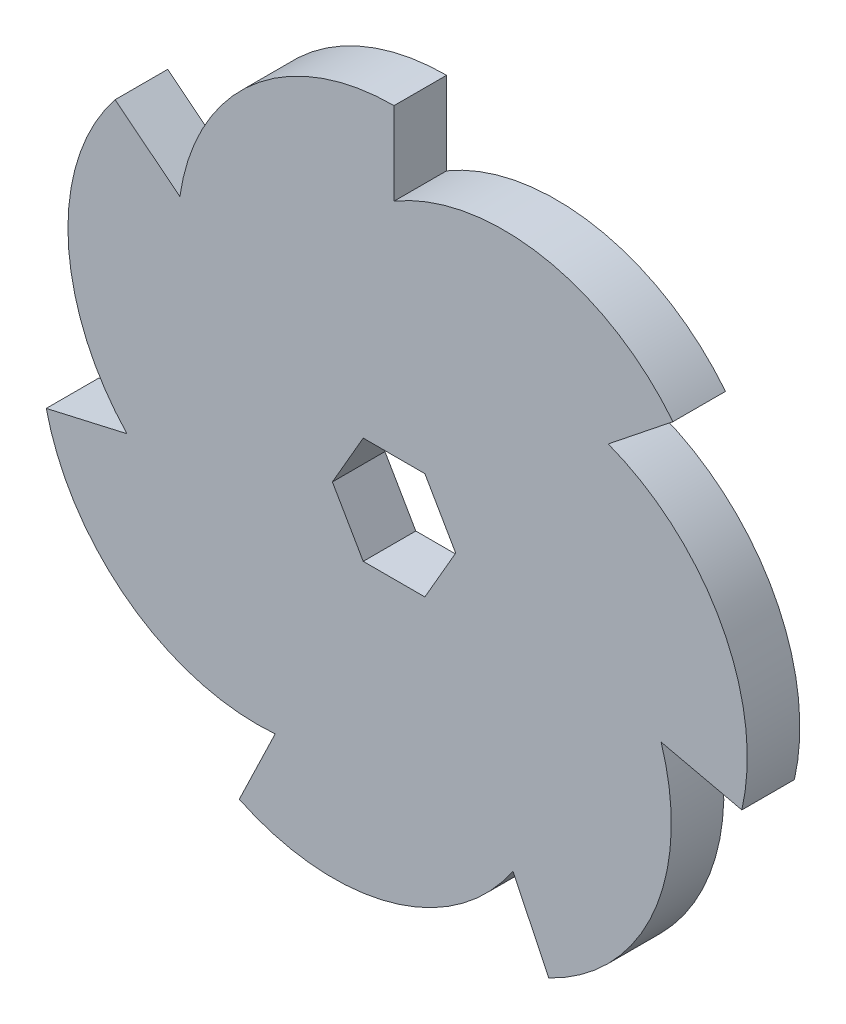
ISO-10303-21;
HEADER;
FILE_DESCRIPTION(('STEP AP214'),'2;1');
FILE_NAME('part.step','',(''),(''),'','','');
FILE_SCHEMA(('AUTOMOTIVE_DESIGN { 1 0 10303 214 1 1 1 1 }'));
ENDSEC;
DATA;
#1=APPLICATION_CONTEXT('core data for automotive mechanical design processes');
#2=APPLICATION_PROTOCOL_DEFINITION('international standard','automotive_design',2000,#1);
#3=PRODUCT_CONTEXT('',#1,'mechanical');
#4=PRODUCT('Part','Part','',(#3));
#5=PRODUCT_RELATED_PRODUCT_CATEGORY('part','',(#4));
#6=PRODUCT_DEFINITION_FORMATION('','',#4);
#7=PRODUCT_DEFINITION_CONTEXT('part definition',#1,'design');
#8=PRODUCT_DEFINITION('design','',#6,#7);
#9=PRODUCT_DEFINITION_SHAPE('','',#8);
#10=(LENGTH_UNIT() NAMED_UNIT(*) SI_UNIT(.MILLI.,.METRE.));
#11=(NAMED_UNIT(*) PLANE_ANGLE_UNIT() SI_UNIT($,.RADIAN.));
#12=(NAMED_UNIT(*) SI_UNIT($,.STERADIAN.) SOLID_ANGLE_UNIT());
#13=UNCERTAINTY_MEASURE_WITH_UNIT(LENGTH_MEASURE(1.E-05),#10,'distance_accuracy_value','');
#14=(GEOMETRIC_REPRESENTATION_CONTEXT(3) GLOBAL_UNCERTAINTY_ASSIGNED_CONTEXT((#13)) GLOBAL_UNIT_ASSIGNED_CONTEXT((#10,
#11,#12)) REPRESENTATION_CONTEXT('',''));
#15=CARTESIAN_POINT('',(0.,0.,0.));
#16=DIRECTION('',(0.,0.,1.));
#17=DIRECTION('',(1.,0.,0.));
#18=AXIS2_PLACEMENT_3D('',#15,#16,#17);
#19=CARTESIAN_POINT('',(0.,0.,3.175));
#20=DIRECTION('',(-0.623489801858732,0.781831482468031,0.));
#21=DIRECTION('',(-0.781831482468031,-0.623489801858732,0.));
#22=AXIS2_PLACEMENT_3D('',#19,#20,#21);
#23=PLANE('',#22);
#24=DIRECTION('',(0.,0.,-1.));
#25=VECTOR('',#24,1.);
#26=CARTESIAN_POINT('',(25.8786220696918,20.637512441524,3.175));
#27=LINE('',#26,#25);
#28=CARTESIAN_POINT('',(25.8786220696918,20.637512441524,3.175));
#29=VERTEX_POINT('',#28);
#30=CARTESIAN_POINT('',(25.8786220696918,20.637512441524,-3.175));
#31=VERTEX_POINT('',#30);
#32=EDGE_CURVE('E369',#29,#31,#27,.T.);
#33=ORIENTED_EDGE('',*,*,#32,.T.);
#34=DIRECTION('',(0.781831482468031,0.623489801858732,0.));
#35=VECTOR('',#34,1.);
#36=CARTESIAN_POINT('',(0.,0.,-3.175));
#37=LINE('',#36,#35);
#38=CARTESIAN_POINT('',(33.6969368943721,26.8724104601114,-3.175));
#39=VERTEX_POINT('',#38);
#40=EDGE_CURVE('E377',#31,#39,#37,.T.);
#41=ORIENTED_EDGE('',*,*,#40,.T.);
#42=DIRECTION('',(0.,0.,-1.));
#43=VECTOR('',#42,1.);
#44=CARTESIAN_POINT('',(33.6969368943721,26.8724104601114,3.175));
#45=LINE('',#44,#43);
#46=CARTESIAN_POINT('',(33.6969368943721,26.8724104601114,3.175));
#47=VERTEX_POINT('',#46);
#48=EDGE_CURVE('E48',#47,#39,#45,.T.);
#49=ORIENTED_EDGE('',*,*,#48,.F.);
#50=DIRECTION('',(0.781831482468031,0.623489801858732,0.));
#51=VECTOR('',#50,1.);
#52=CARTESIAN_POINT('',(0.,0.,3.175));
#53=LINE('',#52,#51);
#54=EDGE_CURVE('E376',#29,#47,#53,.T.);
#55=ORIENTED_EDGE('',*,*,#54,.F.);
#56=EDGE_LOOP('',(#33,#41,#49,#55));
#57=FACE_BOUND('',#56,.T.);
#58=ADVANCED_FACE('F39',(#57),#23,.F.);
#59=CARTESIAN_POINT('',(13.2611223064615,10.5753921461179,3.175));
#60=DIRECTION('',(0.,0.,-1.));
#61=DIRECTION('',(-1.,0.,0.));
#62=AXIS2_PLACEMENT_3D('',#59,#60,#61);
#63=CYLINDRICAL_SURFACE('',#62,26.1383879341879);
#64=CARTESIAN_POINT('',(13.2611223064615,10.5753921461179,-3.175));
#65=DIRECTION('',(0.,0.,1.));
#66=DIRECTION('',(-1.,0.,0.));
#67=AXIS2_PLACEMENT_3D('',#64,#65,#66);
#68=CIRCLE('',#67,26.1383879341879);
#69=CARTESIAN_POINT('',(0.,33.1,-3.175));
#70=VERTEX_POINT('',#69);
#71=EDGE_CURVE('E372',#39,#70,#68,.T.);
#72=ORIENTED_EDGE('',*,*,#71,.T.);
#73=DIRECTION('',(0.,0.,-1.));
#74=VECTOR('',#73,1.);
#75=CARTESIAN_POINT('',(0.,33.1,3.175));
#76=LINE('',#75,#74);
#77=CARTESIAN_POINT('',(0.,33.1,3.175));
#78=VERTEX_POINT('',#77);
#79=EDGE_CURVE('E11',#78,#70,#76,.T.);
#80=ORIENTED_EDGE('',*,*,#79,.F.);
#81=CARTESIAN_POINT('',(13.2611223064615,10.5753921461179,3.175));
#82=DIRECTION('',(0.,0.,1.));
#83=DIRECTION('',(-1.,0.,0.));
#84=AXIS2_PLACEMENT_3D('',#81,#82,#83);
#85=CIRCLE('',#84,26.1383879341879);
#86=EDGE_CURVE('E373',#47,#78,#85,.T.);
#87=ORIENTED_EDGE('',*,*,#86,.F.);
#88=ORIENTED_EDGE('',*,*,#48,.T.);
#89=EDGE_LOOP('',(#72,#80,#87,#88));
#90=FACE_BOUND('',#89,.T.);
#91=ADVANCED_FACE('F41',(#90),#63,.T.);
#92=CARTESIAN_POINT('',(13.2611223064615,10.5753921461179,3.175));
#93=DIRECTION('',(0.,0.,-1.));
#94=DIRECTION('',(-1.,0.,0.));
#95=AXIS2_PLACEMENT_3D('',#92,#93,#94);
#96=PLANE('',#95);
#97=DIRECTION('',(-0.5,0.866025403784438,0.));
#98=VECTOR('',#97,1.);
#99=CARTESIAN_POINT('',(7.44781847254618,0.,3.175));
#100=LINE('',#99,#98);
#101=CARTESIAN_POINT('',(7.44781847254617,0.,3.175));
#102=VERTEX_POINT('',#101);
#103=CARTESIAN_POINT('',(3.72390923627309,6.45,3.175));
#104=VERTEX_POINT('',#103);
#105=EDGE_CURVE('E219',#102,#104,#100,.T.);
#106=ORIENTED_EDGE('',*,*,#105,.F.);
#107=DIRECTION('',(0.5,0.866025403784439,0.));
#108=VECTOR('',#107,1.);
#109=CARTESIAN_POINT('',(3.72390923627309,-6.45,3.175));
#110=LINE('',#109,#108);
#111=CARTESIAN_POINT('',(3.72390923627309,-6.45,3.175));
#112=VERTEX_POINT('',#111);
#113=EDGE_CURVE('E55',#112,#102,#110,.T.);
#114=ORIENTED_EDGE('',*,*,#113,.F.);
#115=DIRECTION('',(1.,0.,0.));
#116=VECTOR('',#115,1.);
#117=CARTESIAN_POINT('',(-3.72390923627308,-6.45,3.175));
#118=LINE('',#117,#116);
#119=CARTESIAN_POINT('',(-3.72390923627308,-6.45,3.175));
#120=VERTEX_POINT('',#119);
#121=EDGE_CURVE('E199',#120,#112,#118,.T.);
#122=ORIENTED_EDGE('',*,*,#121,.F.);
#123=DIRECTION('',(0.5,-0.866025403784438,0.));
#124=VECTOR('',#123,1.);
#125=CARTESIAN_POINT('',(-7.44781847254617,0.,3.175));
#126=LINE('',#125,#124);
#127=CARTESIAN_POINT('',(-7.44781847254617,0.,3.175));
#128=VERTEX_POINT('',#127);
#129=EDGE_CURVE('E203',#128,#120,#126,.T.);
#130=ORIENTED_EDGE('',*,*,#129,.F.);
#131=DIRECTION('',(-0.5,-0.866025403784438,0.));
#132=VECTOR('',#131,1.);
#133=CARTESIAN_POINT('',(-3.72390923627309,6.45,3.175));
#134=LINE('',#133,#132);
#135=CARTESIAN_POINT('',(-3.72390923627309,6.45,3.175));
#136=VERTEX_POINT('',#135);
#137=EDGE_CURVE('E226',#136,#128,#134,.T.);
#138=ORIENTED_EDGE('',*,*,#137,.F.);
#139=DIRECTION('',(-1.,0.,0.));
#140=VECTOR('',#139,1.);
#141=CARTESIAN_POINT('',(3.72390923627309,6.45,3.175));
#142=LINE('',#141,#140);
#143=EDGE_CURVE('E222',#104,#136,#142,.T.);
#144=ORIENTED_EDGE('',*,*,#143,.F.);
#145=EDGE_LOOP('',(#106,#114,#122,#130,#138,#144));
#146=FACE_BOUND('',#145,.T.);
#147=CARTESIAN_POINT('',(16.5363490385602,-3.77431375828926,3.175));
#148=DIRECTION('',(0.,0.,1.));
#149=DIRECTION('',(-0.623489801858732,0.781831482468031,0.));
#150=AXIS2_PLACEMENT_3D('',#147,#148,#149);
#151=CIRCLE('',#150,26.1383879341879);
#152=CARTESIAN_POINT('',(42.0193930150366,-9.59065225351731,3.175));
#153=VERTEX_POINT('',#152);
#154=EDGE_CURVE('E352',#153,#29,#151,.T.);
#155=ORIENTED_EDGE('',*,*,#154,.T.);
#156=ORIENTED_EDGE('',*,*,#54,.T.);
#157=ORIENTED_EDGE('',*,*,#86,.T.);
#158=DIRECTION('',(0.,1.,0.));
#159=VECTOR('',#158,1.);
#160=CARTESIAN_POINT('',(0.,0.,3.175));
#161=LINE('',#160,#159);
#162=CARTESIAN_POINT('',(6.10622663543836E-13,43.1,3.175));
#163=VERTEX_POINT('',#162);
#164=EDGE_CURVE('E251',#78,#163,#161,.T.);
#165=ORIENTED_EDGE('',*,*,#164,.T.);
#166=CARTESIAN_POINT('',(2.37657116208823E-13,16.9616120658121,3.175));
#167=DIRECTION('',(0.,0.,1.));
#168=DIRECTION('',(-0.623489801858743,-0.781831482468022,0.));
#169=AXIS2_PLACEMENT_3D('',#166,#167,#168);
#170=CIRCLE('',#169,26.1383879341879);
#171=CARTESIAN_POINT('',(-25.8786220696915,20.6375124415244,3.175));
#172=VERTEX_POINT('',#171);
#173=EDGE_CURVE('E248',#163,#172,#170,.T.);
#174=ORIENTED_EDGE('',*,*,#173,.T.);
#175=DIRECTION('',(-0.781831482468023,0.623489801858743,0.));
#176=VECTOR('',#175,1.);
#177=CARTESIAN_POINT('',(0.,0.,3.175));
#178=LINE('',#177,#176);
#179=CARTESIAN_POINT('',(-33.6969368943718,26.8724104601118,3.175));
#180=VERTEX_POINT('',#179);
#181=EDGE_CURVE('E271',#172,#180,#178,.T.);
#182=ORIENTED_EDGE('',*,*,#181,.T.);
#183=CARTESIAN_POINT('',(-13.2611223064614,10.575392146118,3.175));
#184=DIRECTION('',(0.,0.,1.));
#185=DIRECTION('',(0.222520933956305,-0.974927912181826,0.));
#186=AXIS2_PLACEMENT_3D('',#183,#184,#185);
#187=CIRCLE('',#186,26.1383879341879);
#188=CARTESIAN_POINT('',(-32.2701138932184,-7.3654429139537,3.175));
#189=VERTEX_POINT('',#188);
#190=EDGE_CURVE('E268',#180,#189,#187,.T.);
#191=ORIENTED_EDGE('',*,*,#190,.T.);
#192=DIRECTION('',(-0.974927912181826,-0.222520933956305,0.));
#193=VECTOR('',#192,1.);
#194=CARTESIAN_POINT('',(0.,0.,3.175));
#195=LINE('',#194,#193);
#196=CARTESIAN_POINT('',(-42.0193930150367,-9.59065225351674,3.175));
#197=VERTEX_POINT('',#196);
#198=EDGE_CURVE('E291',#189,#197,#195,.T.);
#199=ORIENTED_EDGE('',*,*,#198,.T.);
#200=CARTESIAN_POINT('',(-16.5363490385602,-3.77431375828904,3.175));
#201=DIRECTION('',(0.,0.,1.));
#202=DIRECTION('',(0.900968867902416,-0.433883739117565,0.));
#203=AXIS2_PLACEMENT_3D('',#200,#201,#202);
#204=CIRCLE('',#203,26.1383879341879);
#205=CARTESIAN_POINT('',(-14.3615517647914,-29.82206952757,3.175));
#206=VERTEX_POINT('',#205);
#207=EDGE_CURVE('E288',#197,#206,#204,.T.);
#208=ORIENTED_EDGE('',*,*,#207,.T.);
#209=DIRECTION('',(-0.433883739117565,-0.900968867902416,0.));
#210=VECTOR('',#209,1.);
#211=CARTESIAN_POINT('',(0.,0.,3.175));
#212=LINE('',#211,#210);
#213=CARTESIAN_POINT('',(-18.7003891559671,-38.8317582065941,3.175));
#214=VERTEX_POINT('',#213);
#215=EDGE_CURVE('E312',#206,#214,#212,.T.);
#216=ORIENTED_EDGE('',*,*,#215,.T.);
#217=CARTESIAN_POINT('',(-7.35936766457616,-15.2818844207347,3.175));
#218=DIRECTION('',(0.,0.,1.));
#219=DIRECTION('',(0.900968867902422,0.433883739117553,0.));
#220=AXIS2_PLACEMENT_3D('',#217,#218,#219);
#221=CIRCLE('',#220,26.1383879341879);
#222=CARTESIAN_POINT('',(14.361551764791,-29.8220695275702,3.175));
#223=VERTEX_POINT('',#222);
#224=EDGE_CURVE('E308',#214,#223,#221,.T.);
#225=ORIENTED_EDGE('',*,*,#224,.T.);
#226=DIRECTION('',(0.433883739117553,-0.900968867902422,0.));
#227=VECTOR('',#226,1.);
#228=CARTESIAN_POINT('',(0.,0.,3.175));
#229=LINE('',#228,#227);
#230=CARTESIAN_POINT('',(18.7003891559665,-38.8317582065944,3.175));
#231=VERTEX_POINT('',#230);
#232=EDGE_CURVE('E334',#223,#231,#229,.T.);
#233=ORIENTED_EDGE('',*,*,#232,.T.);
#234=CARTESIAN_POINT('',(7.35936766457595,-15.2818844207348,3.175));
#235=DIRECTION('',(0.,0.,1.));
#236=DIRECTION('',(0.222520933956318,0.974927912181823,0.));
#237=AXIS2_PLACEMENT_3D('',#234,#235,#236);
#238=CIRCLE('',#237,26.1383879341879);
#239=CARTESIAN_POINT('',(32.2701138932183,-7.36544291395413,3.175));
#240=VERTEX_POINT('',#239);
#241=EDGE_CURVE('E330',#231,#240,#238,.T.);
#242=ORIENTED_EDGE('',*,*,#241,.T.);
#243=DIRECTION('',(0.974927912181823,-0.222520933956318,0.));
#244=VECTOR('',#243,1.);
#245=CARTESIAN_POINT('',(0.,0.,3.175));
#246=LINE('',#245,#244);
#247=EDGE_CURVE('E356',#240,#153,#246,.T.);
#248=ORIENTED_EDGE('',*,*,#247,.T.);
#249=EDGE_LOOP('',(#155,#156,#157,#165,#174,#182,#191,#199,#208,#216,#225,#233,#242,#248));
#250=FACE_BOUND('',#249,.T.);
#251=ADVANCED_FACE('F406',(#146,#250),#96,.F.);
#252=CARTESIAN_POINT('',(13.2611223064615,10.5753921461179,-3.175));
#253=DIRECTION('',(0.,0.,-1.));
#254=DIRECTION('',(-1.,0.,0.));
#255=AXIS2_PLACEMENT_3D('',#252,#253,#254);
#256=PLANE('',#255);
#257=DIRECTION('',(0.5,0.866025403784439,0.));
#258=VECTOR('',#257,1.);
#259=CARTESIAN_POINT('',(3.72390923627309,-6.45,-3.175));
#260=LINE('',#259,#258);
#261=CARTESIAN_POINT('',(3.72390923627309,-6.45,-3.175));
#262=VERTEX_POINT('',#261);
#263=CARTESIAN_POINT('',(7.44781847254618,0.,-3.175));
#264=VERTEX_POINT('',#263);
#265=EDGE_CURVE('E179',#262,#264,#260,.T.);
#266=ORIENTED_EDGE('',*,*,#265,.T.);
#267=DIRECTION('',(-0.5,0.866025403784438,0.));
#268=VECTOR('',#267,1.);
#269=CARTESIAN_POINT('',(7.44781847254618,0.,-3.175));
#270=LINE('',#269,#268);
#271=CARTESIAN_POINT('',(3.72390923627308,6.45,-3.175));
#272=VERTEX_POINT('',#271);
#273=EDGE_CURVE('E189',#264,#272,#270,.T.);
#274=ORIENTED_EDGE('',*,*,#273,.T.);
#275=DIRECTION('',(-1.,0.,0.));
#276=VECTOR('',#275,1.);
#277=CARTESIAN_POINT('',(3.72390923627309,6.45,-3.175));
#278=LINE('',#277,#276);
#279=CARTESIAN_POINT('',(-3.72390923627309,6.45,-3.175));
#280=VERTEX_POINT('',#279);
#281=EDGE_CURVE('E63',#272,#280,#278,.T.);
#282=ORIENTED_EDGE('',*,*,#281,.T.);
#283=DIRECTION('',(-0.5,-0.866025403784438,0.));
#284=VECTOR('',#283,1.);
#285=CARTESIAN_POINT('',(-3.72390923627309,6.45,-3.175));
#286=LINE('',#285,#284);
#287=CARTESIAN_POINT('',(-7.44781847254617,0.,-3.175));
#288=VERTEX_POINT('',#287);
#289=EDGE_CURVE('E208',#280,#288,#286,.T.);
#290=ORIENTED_EDGE('',*,*,#289,.T.);
#291=DIRECTION('',(0.5,-0.866025403784438,0.));
#292=VECTOR('',#291,1.);
#293=CARTESIAN_POINT('',(-7.44781847254617,0.,-3.175));
#294=LINE('',#293,#292);
#295=CARTESIAN_POINT('',(-3.72390923627308,-6.45,-3.175));
#296=VERTEX_POINT('',#295);
#297=EDGE_CURVE('E212',#288,#296,#294,.T.);
#298=ORIENTED_EDGE('',*,*,#297,.T.);
#299=DIRECTION('',(1.,0.,0.));
#300=VECTOR('',#299,1.);
#301=CARTESIAN_POINT('',(-3.72390923627308,-6.45,-3.175));
#302=LINE('',#301,#300);
#303=EDGE_CURVE('E186',#296,#262,#302,.T.);
#304=ORIENTED_EDGE('',*,*,#303,.T.);
#305=EDGE_LOOP('',(#266,#274,#282,#290,#298,#304));
#306=FACE_BOUND('',#305,.T.);
#307=ORIENTED_EDGE('',*,*,#40,.F.);
#308=CARTESIAN_POINT('',(16.5363490385602,-3.77431375828926,-3.175));
#309=DIRECTION('',(0.,0.,1.));
#310=DIRECTION('',(-0.623489801858732,0.781831482468031,0.));
#311=AXIS2_PLACEMENT_3D('',#308,#309,#310);
#312=CIRCLE('',#311,26.1383879341879);
#313=CARTESIAN_POINT('',(42.0193930150366,-9.59065225351731,-3.175));
#314=VERTEX_POINT('',#313);
#315=EDGE_CURVE('E351',#314,#31,#312,.T.);
#316=ORIENTED_EDGE('',*,*,#315,.F.);
#317=DIRECTION('',(0.974927912181823,-0.222520933956318,0.));
#318=VECTOR('',#317,1.);
#319=CARTESIAN_POINT('',(0.,0.,-3.175));
#320=LINE('',#319,#318);
#321=CARTESIAN_POINT('',(32.2701138932183,-7.36544291395413,-3.175));
#322=VERTEX_POINT('',#321);
#323=EDGE_CURVE('E357',#322,#314,#320,.T.);
#324=ORIENTED_EDGE('',*,*,#323,.F.);
#325=CARTESIAN_POINT('',(7.35936766457595,-15.2818844207348,-3.175));
#326=DIRECTION('',(0.,0.,1.));
#327=DIRECTION('',(0.222520933956318,0.974927912181823,0.));
#328=AXIS2_PLACEMENT_3D('',#325,#326,#327);
#329=CIRCLE('',#328,26.1383879341879);
#330=CARTESIAN_POINT('',(18.7003891559665,-38.8317582065944,-3.175));
#331=VERTEX_POINT('',#330);
#332=EDGE_CURVE('E329',#331,#322,#329,.T.);
#333=ORIENTED_EDGE('',*,*,#332,.F.);
#334=DIRECTION('',(0.433883739117553,-0.900968867902422,0.));
#335=VECTOR('',#334,1.);
#336=CARTESIAN_POINT('',(0.,0.,-3.175));
#337=LINE('',#336,#335);
#338=CARTESIAN_POINT('',(14.361551764791,-29.8220695275702,-3.175));
#339=VERTEX_POINT('',#338);
#340=EDGE_CURVE('E335',#339,#331,#337,.T.);
#341=ORIENTED_EDGE('',*,*,#340,.F.);
#342=CARTESIAN_POINT('',(-7.35936766457616,-15.2818844207347,-3.175));
#343=DIRECTION('',(0.,0.,1.));
#344=DIRECTION('',(0.900968867902422,0.433883739117553,0.));
#345=AXIS2_PLACEMENT_3D('',#342,#343,#344);
#346=CIRCLE('',#345,26.1383879341879);
#347=CARTESIAN_POINT('',(-18.7003891559671,-38.8317582065941,-3.175));
#348=VERTEX_POINT('',#347);
#349=EDGE_CURVE('E307',#348,#339,#346,.T.);
#350=ORIENTED_EDGE('',*,*,#349,.F.);
#351=DIRECTION('',(-0.433883739117565,-0.900968867902416,0.));
#352=VECTOR('',#351,1.);
#353=CARTESIAN_POINT('',(0.,0.,-3.175));
#354=LINE('',#353,#352);
#355=CARTESIAN_POINT('',(-14.3615517647914,-29.82206952757,-3.175));
#356=VERTEX_POINT('',#355);
#357=EDGE_CURVE('E313',#356,#348,#354,.T.);
#358=ORIENTED_EDGE('',*,*,#357,.F.);
#359=CARTESIAN_POINT('',(-16.5363490385602,-3.77431375828904,-3.175));
#360=DIRECTION('',(0.,0.,1.));
#361=DIRECTION('',(0.900968867902416,-0.433883739117565,0.));
#362=AXIS2_PLACEMENT_3D('',#359,#360,#361);
#363=CIRCLE('',#362,26.1383879341879);
#364=CARTESIAN_POINT('',(-42.0193930150367,-9.59065225351674,-3.175));
#365=VERTEX_POINT('',#364);
#366=EDGE_CURVE('E287',#365,#356,#363,.T.);
#367=ORIENTED_EDGE('',*,*,#366,.F.);
#368=DIRECTION('',(-0.974927912181826,-0.222520933956305,0.));
#369=VECTOR('',#368,1.);
#370=CARTESIAN_POINT('',(0.,0.,-3.175));
#371=LINE('',#370,#369);
#372=CARTESIAN_POINT('',(-32.2701138932184,-7.36544291395369,-3.175));
#373=VERTEX_POINT('',#372);
#374=EDGE_CURVE('E292',#373,#365,#371,.T.);
#375=ORIENTED_EDGE('',*,*,#374,.F.);
#376=CARTESIAN_POINT('',(-13.2611223064614,10.575392146118,-3.175));
#377=DIRECTION('',(0.,0.,1.));
#378=DIRECTION('',(0.222520933956305,-0.974927912181826,0.));
#379=AXIS2_PLACEMENT_3D('',#376,#377,#378);
#380=CIRCLE('',#379,26.1383879341879);
#381=CARTESIAN_POINT('',(-33.6969368943718,26.8724104601118,-3.175));
#382=VERTEX_POINT('',#381);
#383=EDGE_CURVE('E267',#382,#373,#380,.T.);
#384=ORIENTED_EDGE('',*,*,#383,.F.);
#385=DIRECTION('',(-0.781831482468023,0.623489801858743,0.));
#386=VECTOR('',#385,1.);
#387=CARTESIAN_POINT('',(0.,0.,-3.175));
#388=LINE('',#387,#386);
#389=CARTESIAN_POINT('',(-25.8786220696916,20.6375124415244,-3.175));
#390=VERTEX_POINT('',#389);
#391=EDGE_CURVE('E272',#390,#382,#388,.T.);
#392=ORIENTED_EDGE('',*,*,#391,.F.);
#393=CARTESIAN_POINT('',(2.37657116208823E-13,16.9616120658121,-3.175));
#394=DIRECTION('',(0.,0.,1.));
#395=DIRECTION('',(-0.623489801858743,-0.781831482468022,0.));
#396=AXIS2_PLACEMENT_3D('',#393,#394,#395);
#397=CIRCLE('',#396,26.1383879341879);
#398=CARTESIAN_POINT('',(6.10622663543836E-13,43.1,-3.175));
#399=VERTEX_POINT('',#398);
#400=EDGE_CURVE('E236',#399,#390,#397,.T.);
#401=ORIENTED_EDGE('',*,*,#400,.F.);
#402=DIRECTION('',(0.,1.,0.));
#403=VECTOR('',#402,1.);
#404=CARTESIAN_POINT('',(0.,0.,-3.175));
#405=LINE('',#404,#403);
#406=EDGE_CURVE('E252',#70,#399,#405,.T.);
#407=ORIENTED_EDGE('',*,*,#406,.F.);
#408=ORIENTED_EDGE('',*,*,#71,.F.);
#409=EDGE_LOOP('',(#307,#316,#324,#333,#341,#350,#358,#367,#375,#384,#392,#401,#407,#408));
#410=FACE_BOUND('',#409,.T.);
#411=ADVANCED_FACE('F194',(#306,#410),#256,.T.);
#412=CARTESIAN_POINT('',(0.,0.,3.175));
#413=DIRECTION('',(-1.,0.,0.));
#414=DIRECTION('',(0.,-1.,0.));
#415=AXIS2_PLACEMENT_3D('',#412,#413,#414);
#416=PLANE('',#415);
#417=ORIENTED_EDGE('',*,*,#164,.F.);
#418=ORIENTED_EDGE('',*,*,#79,.T.);
#419=ORIENTED_EDGE('',*,*,#406,.T.);
#420=DIRECTION('',(0.,0.,-1.));
#421=VECTOR('',#420,1.);
#422=CARTESIAN_POINT('',(6.10622663543836E-13,43.1,3.175));
#423=LINE('',#422,#421);
#424=EDGE_CURVE('E255',#163,#399,#423,.T.);
#425=ORIENTED_EDGE('',*,*,#424,.F.);
#426=EDGE_LOOP('',(#417,#418,#419,#425));
#427=FACE_BOUND('',#426,.T.);
#428=ADVANCED_FACE('F399',(#427),#416,.F.);
#429=CARTESIAN_POINT('',(0.,0.,3.175));
#430=DIRECTION('',(0.222520933956318,0.974927912181823,0.));
#431=DIRECTION('',(-0.974927912181823,0.222520933956318,0.));
#432=AXIS2_PLACEMENT_3D('',#429,#430,#431);
#433=PLANE('',#432);
#434=DIRECTION('',(0.,0.,-1.));
#435=VECTOR('',#434,1.);
#436=CARTESIAN_POINT('',(32.2701138932183,-7.36544291395413,3.175));
#437=LINE('',#436,#435);
#438=EDGE_CURVE('E347',#240,#322,#437,.T.);
#439=ORIENTED_EDGE('',*,*,#438,.T.);
#440=ORIENTED_EDGE('',*,*,#323,.T.);
#441=DIRECTION('',(0.,0.,-1.));
#442=VECTOR('',#441,1.);
#443=CARTESIAN_POINT('',(42.0193930150366,-9.59065225351731,3.175));
#444=LINE('',#443,#442);
#445=EDGE_CURVE('E360',#153,#314,#444,.T.);
#446=ORIENTED_EDGE('',*,*,#445,.F.);
#447=ORIENTED_EDGE('',*,*,#247,.F.);
#448=EDGE_LOOP('',(#439,#440,#446,#447));
#449=FACE_BOUND('',#448,.T.);
#450=ADVANCED_FACE('F416',(#449),#433,.F.);
#451=CARTESIAN_POINT('',(16.5363490385602,-3.77431375828926,3.175));
#452=DIRECTION('',(0.,0.,-1.));
#453=DIRECTION('',(-1.,0.,0.));
#454=AXIS2_PLACEMENT_3D('',#451,#452,#453);
#455=CYLINDRICAL_SURFACE('',#454,26.1383879341879);
#456=ORIENTED_EDGE('',*,*,#315,.T.);
#457=ORIENTED_EDGE('',*,*,#32,.F.);
#458=ORIENTED_EDGE('',*,*,#154,.F.);
#459=ORIENTED_EDGE('',*,*,#445,.T.);
#460=EDGE_LOOP('',(#456,#457,#458,#459));
#461=FACE_BOUND('',#460,.T.);
#462=ADVANCED_FACE('F411',(#461),#455,.T.);
#463=CARTESIAN_POINT('',(0.,0.,3.175));
#464=DIRECTION('',(0.900968867902422,0.433883739117553,0.));
#465=DIRECTION('',(-0.433883739117553,0.900968867902422,0.));
#466=AXIS2_PLACEMENT_3D('',#463,#464,#465);
#467=PLANE('',#466);
#468=DIRECTION('',(0.,0.,-1.));
#469=VECTOR('',#468,1.);
#470=CARTESIAN_POINT('',(14.361551764791,-29.8220695275702,3.175));
#471=LINE('',#470,#469);
#472=EDGE_CURVE('E325',#223,#339,#471,.T.);
#473=ORIENTED_EDGE('',*,*,#472,.T.);
#474=ORIENTED_EDGE('',*,*,#340,.T.);
#475=DIRECTION('',(0.,0.,-1.));
#476=VECTOR('',#475,1.);
#477=CARTESIAN_POINT('',(18.7003891559665,-38.8317582065944,3.175));
#478=LINE('',#477,#476);
#479=EDGE_CURVE('E338',#231,#331,#478,.T.);
#480=ORIENTED_EDGE('',*,*,#479,.F.);
#481=ORIENTED_EDGE('',*,*,#232,.F.);
#482=EDGE_LOOP('',(#473,#474,#480,#481));
#483=FACE_BOUND('',#482,.T.);
#484=ADVANCED_FACE('F422',(#483),#467,.F.);
#485=CARTESIAN_POINT('',(7.35936766457595,-15.2818844207348,3.175));
#486=DIRECTION('',(0.,0.,-1.));
#487=DIRECTION('',(-1.,0.,0.));
#488=AXIS2_PLACEMENT_3D('',#485,#486,#487);
#489=CYLINDRICAL_SURFACE('',#488,26.1383879341879);
#490=ORIENTED_EDGE('',*,*,#332,.T.);
#491=ORIENTED_EDGE('',*,*,#438,.F.);
#492=ORIENTED_EDGE('',*,*,#241,.F.);
#493=ORIENTED_EDGE('',*,*,#479,.T.);
#494=EDGE_LOOP('',(#490,#491,#492,#493));
#495=FACE_BOUND('',#494,.T.);
#496=ADVANCED_FACE('F419',(#495),#489,.T.);
#497=CARTESIAN_POINT('',(-7.35936766457616,-15.2818844207347,3.175));
#498=DIRECTION('',(0.,0.,-1.));
#499=DIRECTION('',(-1.,0.,0.));
#500=AXIS2_PLACEMENT_3D('',#497,#498,#499);
#501=CYLINDRICAL_SURFACE('',#500,26.1383879341879);
#502=ORIENTED_EDGE('',*,*,#349,.T.);
#503=ORIENTED_EDGE('',*,*,#472,.F.);
#504=ORIENTED_EDGE('',*,*,#224,.F.);
#505=DIRECTION('',(0.,0.,-1.));
#506=VECTOR('',#505,1.);
#507=CARTESIAN_POINT('',(-18.7003891559671,-38.8317582065941,3.175));
#508=LINE('',#507,#506);
#509=EDGE_CURVE('E316',#214,#348,#508,.T.);
#510=ORIENTED_EDGE('',*,*,#509,.T.);
#511=EDGE_LOOP('',(#502,#503,#504,#510));
#512=FACE_BOUND('',#511,.T.);
#513=ADVANCED_FACE('F428',(#512),#501,.T.);
#514=CARTESIAN_POINT('',(0.,0.,3.175));
#515=DIRECTION('',(0.900968867902416,-0.433883739117565,0.));
#516=DIRECTION('',(0.433883739117565,0.900968867902416,0.));
#517=AXIS2_PLACEMENT_3D('',#514,#515,#516);
#518=PLANE('',#517);
#519=ORIENTED_EDGE('',*,*,#215,.F.);
#520=DIRECTION('',(0.,0.,-1.));
#521=VECTOR('',#520,1.);
#522=CARTESIAN_POINT('',(-14.3615517647914,-29.82206952757,3.175));
#523=LINE('',#522,#521);
#524=EDGE_CURVE('E303',#206,#356,#523,.T.);
#525=ORIENTED_EDGE('',*,*,#524,.T.);
#526=ORIENTED_EDGE('',*,*,#357,.T.);
#527=ORIENTED_EDGE('',*,*,#509,.F.);
#528=EDGE_LOOP('',(#519,#525,#526,#527));
#529=FACE_BOUND('',#528,.T.);
#530=ADVANCED_FACE('F433',(#529),#518,.F.);
#531=CARTESIAN_POINT('',(-16.5363490385602,-3.77431375828904,3.175));
#532=DIRECTION('',(0.,0.,-1.));
#533=DIRECTION('',(-1.,0.,0.));
#534=AXIS2_PLACEMENT_3D('',#531,#532,#533);
#535=CYLINDRICAL_SURFACE('',#534,26.1383879341879);
#536=ORIENTED_EDGE('',*,*,#366,.T.);
#537=ORIENTED_EDGE('',*,*,#524,.F.);
#538=ORIENTED_EDGE('',*,*,#207,.F.);
#539=DIRECTION('',(0.,0.,-1.));
#540=VECTOR('',#539,1.);
#541=CARTESIAN_POINT('',(-42.0193930150367,-9.59065225351674,3.175));
#542=LINE('',#541,#540);
#543=EDGE_CURVE('E295',#197,#365,#542,.T.);
#544=ORIENTED_EDGE('',*,*,#543,.T.);
#545=EDGE_LOOP('',(#536,#537,#538,#544));
#546=FACE_BOUND('',#545,.T.);
#547=ADVANCED_FACE('F437',(#546),#535,.T.);
#548=CARTESIAN_POINT('',(0.,0.,3.175));
#549=DIRECTION('',(0.222520933956305,-0.974927912181826,0.));
#550=DIRECTION('',(0.974927912181826,0.222520933956305,0.));
#551=AXIS2_PLACEMENT_3D('',#548,#549,#550);
#552=PLANE('',#551);
#553=ORIENTED_EDGE('',*,*,#198,.F.);
#554=DIRECTION('',(0.,0.,-1.));
#555=VECTOR('',#554,1.);
#556=CARTESIAN_POINT('',(-32.2701138932184,-7.3654429139537,3.175));
#557=LINE('',#556,#555);
#558=EDGE_CURVE('E283',#189,#373,#557,.T.);
#559=ORIENTED_EDGE('',*,*,#558,.T.);
#560=ORIENTED_EDGE('',*,*,#374,.T.);
#561=ORIENTED_EDGE('',*,*,#543,.F.);
#562=EDGE_LOOP('',(#553,#559,#560,#561));
#563=FACE_BOUND('',#562,.T.);
#564=ADVANCED_FACE('F443',(#563),#552,.F.);
#565=CARTESIAN_POINT('',(-13.2611223064614,10.575392146118,3.175));
#566=DIRECTION('',(0.,0.,-1.));
#567=DIRECTION('',(-1.,0.,0.));
#568=AXIS2_PLACEMENT_3D('',#565,#566,#567);
#569=CYLINDRICAL_SURFACE('',#568,26.1383879341879);
#570=ORIENTED_EDGE('',*,*,#383,.T.);
#571=ORIENTED_EDGE('',*,*,#558,.F.);
#572=ORIENTED_EDGE('',*,*,#190,.F.);
#573=DIRECTION('',(0.,0.,-1.));
#574=VECTOR('',#573,1.);
#575=CARTESIAN_POINT('',(-33.6969368943718,26.8724104601118,3.175));
#576=LINE('',#575,#574);
#577=EDGE_CURVE('E275',#180,#382,#576,.T.);
#578=ORIENTED_EDGE('',*,*,#577,.T.);
#579=EDGE_LOOP('',(#570,#571,#572,#578));
#580=FACE_BOUND('',#579,.T.);
#581=ADVANCED_FACE('F447',(#580),#569,.T.);
#582=CARTESIAN_POINT('',(0.,0.,3.175));
#583=DIRECTION('',(-0.623489801858742,-0.781831482468023,0.));
#584=DIRECTION('',(0.781831482468023,-0.623489801858742,0.));
#585=AXIS2_PLACEMENT_3D('',#582,#583,#584);
#586=PLANE('',#585);
#587=ORIENTED_EDGE('',*,*,#181,.F.);
#588=DIRECTION('',(0.,0.,-1.));
#589=VECTOR('',#588,1.);
#590=CARTESIAN_POINT('',(-25.8786220696915,20.6375124415244,3.175));
#591=LINE('',#590,#589);
#592=EDGE_CURVE('E263',#172,#390,#591,.T.);
#593=ORIENTED_EDGE('',*,*,#592,.T.);
#594=ORIENTED_EDGE('',*,*,#391,.T.);
#595=ORIENTED_EDGE('',*,*,#577,.F.);
#596=EDGE_LOOP('',(#587,#593,#594,#595));
#597=FACE_BOUND('',#596,.T.);
#598=ADVANCED_FACE('F449',(#597),#586,.F.);
#599=CARTESIAN_POINT('',(2.37657116208823E-13,16.9616120658121,3.175));
#600=DIRECTION('',(0.,0.,-1.));
#601=DIRECTION('',(-1.,0.,0.));
#602=AXIS2_PLACEMENT_3D('',#599,#600,#601);
#603=CYLINDRICAL_SURFACE('',#602,26.1383879341879);
#604=ORIENTED_EDGE('',*,*,#400,.T.);
#605=ORIENTED_EDGE('',*,*,#592,.F.);
#606=ORIENTED_EDGE('',*,*,#173,.F.);
#607=ORIENTED_EDGE('',*,*,#424,.T.);
#608=EDGE_LOOP('',(#604,#605,#606,#607));
#609=FACE_BOUND('',#608,.T.);
#610=ADVANCED_FACE('F402',(#609),#603,.T.);
#611=CARTESIAN_POINT('',(3.72390923627309,-6.45,-3.175));
#612=DIRECTION('',(0.866025403784439,-0.5,0.));
#613=DIRECTION('',(0.5,0.866025403784439,0.));
#614=AXIS2_PLACEMENT_3D('',#611,#612,#613);
#615=PLANE('',#614);
#616=ORIENTED_EDGE('',*,*,#113,.T.);
#617=DIRECTION('',(0.,0.,1.));
#618=VECTOR('',#617,1.);
#619=CARTESIAN_POINT('',(7.44781847254618,0.,-3.175));
#620=LINE('',#619,#618);
#621=EDGE_CURVE('E175',#264,#102,#620,.T.);
#622=ORIENTED_EDGE('',*,*,#621,.F.);
#623=ORIENTED_EDGE('',*,*,#265,.F.);
#624=DIRECTION('',(0.,0.,1.));
#625=VECTOR('',#624,1.);
#626=CARTESIAN_POINT('',(3.72390923627309,-6.45,-3.175));
#627=LINE('',#626,#625);
#628=EDGE_CURVE('E233',#262,#112,#627,.T.);
#629=ORIENTED_EDGE('',*,*,#628,.T.);
#630=EDGE_LOOP('',(#616,#622,#623,#629));
#631=FACE_BOUND('',#630,.T.);
#632=ADVANCED_FACE('F177',(#631),#615,.F.);
#633=CARTESIAN_POINT('',(-3.72390923627308,-6.45,-3.175));
#634=DIRECTION('',(0.,-1.,0.));
#635=DIRECTION('',(1.,0.,0.));
#636=AXIS2_PLACEMENT_3D('',#633,#634,#635);
#637=PLANE('',#636);
#638=ORIENTED_EDGE('',*,*,#121,.T.);
#639=ORIENTED_EDGE('',*,*,#628,.F.);
#640=ORIENTED_EDGE('',*,*,#303,.F.);
#641=DIRECTION('',(0.,0.,1.));
#642=VECTOR('',#641,1.);
#643=CARTESIAN_POINT('',(-3.72390923627308,-6.45,-3.175));
#644=LINE('',#643,#642);
#645=EDGE_CURVE('E237',#296,#120,#644,.T.);
#646=ORIENTED_EDGE('',*,*,#645,.T.);
#647=EDGE_LOOP('',(#638,#639,#640,#646));
#648=FACE_BOUND('',#647,.T.);
#649=ADVANCED_FACE('F527',(#648),#637,.F.);
#650=CARTESIAN_POINT('',(-7.44781847254617,0.,-3.175));
#651=DIRECTION('',(-0.866025403784438,-0.5,0.));
#652=DIRECTION('',(0.5,-0.866025403784439,0.));
#653=AXIS2_PLACEMENT_3D('',#650,#651,#652);
#654=PLANE('',#653);
#655=ORIENTED_EDGE('',*,*,#129,.T.);
#656=ORIENTED_EDGE('',*,*,#645,.F.);
#657=ORIENTED_EDGE('',*,*,#297,.F.);
#658=DIRECTION('',(0.,0.,1.));
#659=VECTOR('',#658,1.);
#660=CARTESIAN_POINT('',(-7.44781847254617,0.,-3.175));
#661=LINE('',#660,#659);
#662=EDGE_CURVE('E240',#288,#128,#661,.T.);
#663=ORIENTED_EDGE('',*,*,#662,.T.);
#664=EDGE_LOOP('',(#655,#656,#657,#663));
#665=FACE_BOUND('',#664,.T.);
#666=ADVANCED_FACE('F536',(#665),#654,.F.);
#667=CARTESIAN_POINT('',(-3.72390923627309,6.45,-3.175));
#668=DIRECTION('',(-0.866025403784438,0.5,0.));
#669=DIRECTION('',(-0.5,-0.866025403784439,0.));
#670=AXIS2_PLACEMENT_3D('',#667,#668,#669);
#671=PLANE('',#670);
#672=ORIENTED_EDGE('',*,*,#137,.T.);
#673=ORIENTED_EDGE('',*,*,#662,.F.);
#674=ORIENTED_EDGE('',*,*,#289,.F.);
#675=DIRECTION('',(0.,0.,1.));
#676=VECTOR('',#675,1.);
#677=CARTESIAN_POINT('',(-3.72390923627309,6.45,-3.175));
#678=LINE('',#677,#676);
#679=EDGE_CURVE('E243',#280,#136,#678,.T.);
#680=ORIENTED_EDGE('',*,*,#679,.T.);
#681=EDGE_LOOP('',(#672,#673,#674,#680));
#682=FACE_BOUND('',#681,.T.);
#683=ADVANCED_FACE('F546',(#682),#671,.F.);
#684=CARTESIAN_POINT('',(3.72390923627309,6.45,-3.175));
#685=DIRECTION('',(0.,1.,0.));
#686=DIRECTION('',(0.,0.,1.));
#687=AXIS2_PLACEMENT_3D('',#684,#685,#686);
#688=PLANE('',#687);
#689=ORIENTED_EDGE('',*,*,#143,.T.);
#690=ORIENTED_EDGE('',*,*,#679,.F.);
#691=ORIENTED_EDGE('',*,*,#281,.F.);
#692=DIRECTION('',(0.,0.,1.));
#693=VECTOR('',#692,1.);
#694=CARTESIAN_POINT('',(3.72390923627309,6.45,-3.175));
#695=LINE('',#694,#693);
#696=EDGE_CURVE('E185',#272,#104,#695,.T.);
#697=ORIENTED_EDGE('',*,*,#696,.T.);
#698=EDGE_LOOP('',(#689,#690,#691,#697));
#699=FACE_BOUND('',#698,.T.);
#700=ADVANCED_FACE('F556',(#699),#688,.F.);
#701=CARTESIAN_POINT('',(7.44781847254618,0.,-3.175));
#702=DIRECTION('',(0.866025403784439,0.5,0.));
#703=DIRECTION('',(-0.5,0.866025403784439,0.));
#704=AXIS2_PLACEMENT_3D('',#701,#702,#703);
#705=PLANE('',#704);
#706=ORIENTED_EDGE('',*,*,#105,.T.);
#707=ORIENTED_EDGE('',*,*,#696,.F.);
#708=ORIENTED_EDGE('',*,*,#273,.F.);
#709=ORIENTED_EDGE('',*,*,#621,.T.);
#710=EDGE_LOOP('',(#706,#707,#708,#709));
#711=FACE_BOUND('',#710,.T.);
#712=ADVANCED_FACE('F190',(#711),#705,.F.);
#713=CLOSED_SHELL('',(#58,#91,#251,#411,#428,#450,#462,#484,#496,#513,#530,#547,#564,#581,#598,
#610,#632,#649,#666,#683,#700,#712));
#714=MANIFOLD_SOLID_BREP('B2',#713);
#715=ADVANCED_BREP_SHAPE_REPRESENTATION('',(#18,#714),#14);
#716=SHAPE_DEFINITION_REPRESENTATION(#9,#715);
ENDSEC;
END-ISO-10303-21;
